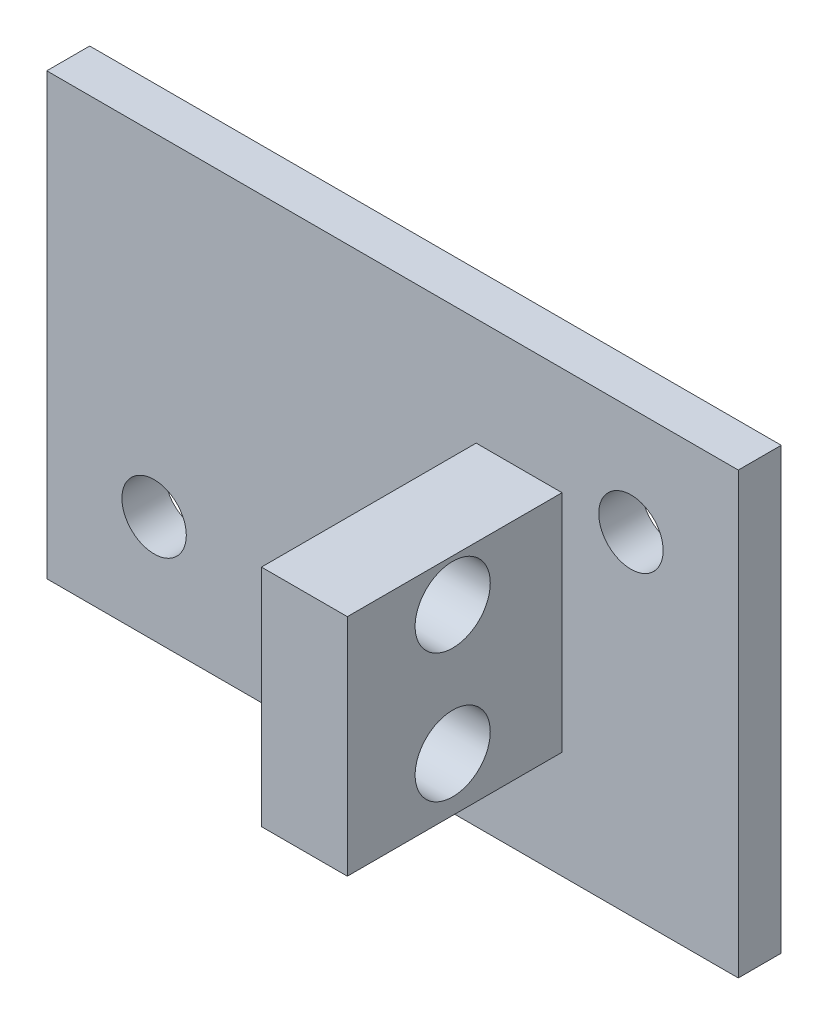
ISO-10303-21;
HEADER;
FILE_DESCRIPTION(('STEP AP214'),'2;1');
FILE_NAME('part.step','',(''),(''),'','','');
FILE_SCHEMA(('AUTOMOTIVE_DESIGN { 1 0 10303 214 1 1 1 1 }'));
ENDSEC;
DATA;
#1=APPLICATION_CONTEXT('core data for automotive mechanical design processes');
#2=APPLICATION_PROTOCOL_DEFINITION('international standard','automotive_design',2000,#1);
#3=PRODUCT_CONTEXT('',#1,'mechanical');
#4=PRODUCT('Part','Part','',(#3));
#5=PRODUCT_RELATED_PRODUCT_CATEGORY('part','',(#4));
#6=PRODUCT_DEFINITION_FORMATION('','',#4);
#7=PRODUCT_DEFINITION_CONTEXT('part definition',#1,'design');
#8=PRODUCT_DEFINITION('design','',#6,#7);
#9=PRODUCT_DEFINITION_SHAPE('','',#8);
#10=(LENGTH_UNIT() NAMED_UNIT(*) SI_UNIT(.MILLI.,.METRE.));
#11=(NAMED_UNIT(*) PLANE_ANGLE_UNIT() SI_UNIT($,.RADIAN.));
#12=(NAMED_UNIT(*) SI_UNIT($,.STERADIAN.) SOLID_ANGLE_UNIT());
#13=UNCERTAINTY_MEASURE_WITH_UNIT(LENGTH_MEASURE(1.E-05),#10,'distance_accuracy_value','');
#14=(GEOMETRIC_REPRESENTATION_CONTEXT(3) GLOBAL_UNCERTAINTY_ASSIGNED_CONTEXT((#13)) GLOBAL_UNIT_ASSIGNED_CONTEXT((#10,
#11,#12)) REPRESENTATION_CONTEXT('',''));
#15=CARTESIAN_POINT('',(0.,0.,0.));
#16=DIRECTION('',(0.,0.,1.));
#17=DIRECTION('',(1.,0.,0.));
#18=AXIS2_PLACEMENT_3D('',#15,#16,#17);
#19=CARTESIAN_POINT('',(0.,0.,2.));
#20=DIRECTION('',(0.,0.,1.));
#21=DIRECTION('',(1.,0.,0.));
#22=AXIS2_PLACEMENT_3D('',#19,#20,#21);
#23=PLANE('',#22);
#24=CARTESIAN_POINT('',(27.21,15.49,2.));
#25=DIRECTION('',(0.,0.,1.));
#26=DIRECTION('',(1.,0.,0.));
#27=AXIS2_PLACEMENT_3D('',#24,#25,#26);
#28=CIRCLE('',#27,1.5);
#29=CARTESIAN_POINT('',(28.71,15.49,2.));
#30=VERTEX_POINT('',#29);
#31=EDGE_CURVE('E143',#30,#30,#28,.T.);
#32=ORIENTED_EDGE('',*,*,#31,.F.);
#33=EDGE_LOOP('',(#32));
#34=FACE_BOUND('',#33,.T.);
#35=CARTESIAN_POINT('',(5.,5.,2.));
#36=DIRECTION('',(0.,0.,1.));
#37=DIRECTION('',(1.,0.,0.));
#38=AXIS2_PLACEMENT_3D('',#35,#36,#37);
#39=CIRCLE('',#38,1.5);
#40=CARTESIAN_POINT('',(6.5,5.,2.));
#41=VERTEX_POINT('',#40);
#42=EDGE_CURVE('E146',#41,#41,#39,.T.);
#43=ORIENTED_EDGE('',*,*,#42,.F.);
#44=EDGE_LOOP('',(#43));
#45=FACE_BOUND('',#44,.T.);
#46=DIRECTION('',(1.,0.,0.));
#47=VECTOR('',#46,1.);
#48=CARTESIAN_POINT('',(0.,0.,2.));
#49=LINE('',#48,#47);
#50=CARTESIAN_POINT('',(0.,0.,2.));
#51=VERTEX_POINT('',#50);
#52=CARTESIAN_POINT('',(32.21,0.,2.));
#53=VERTEX_POINT('',#52);
#54=EDGE_CURVE('E150',#51,#53,#49,.T.);
#55=ORIENTED_EDGE('',*,*,#54,.T.);
#56=DIRECTION('',(0.,1.,0.));
#57=VECTOR('',#56,1.);
#58=CARTESIAN_POINT('',(32.21,0.,2.));
#59=LINE('',#58,#57);
#60=CARTESIAN_POINT('',(32.21,20.49,2.));
#61=VERTEX_POINT('',#60);
#62=EDGE_CURVE('E87',#53,#61,#59,.T.);
#63=ORIENTED_EDGE('',*,*,#62,.T.);
#64=DIRECTION('',(1.,0.,0.));
#65=VECTOR('',#64,1.);
#66=CARTESIAN_POINT('',(0.,20.49,2.));
#67=LINE('',#66,#65);
#68=CARTESIAN_POINT('',(0.,20.49,2.));
#69=VERTEX_POINT('',#68);
#70=EDGE_CURVE('E153',#69,#61,#67,.T.);
#71=ORIENTED_EDGE('',*,*,#70,.F.);
#72=DIRECTION('',(0.,1.,0.));
#73=VECTOR('',#72,1.);
#74=CARTESIAN_POINT('',(0.,0.,2.));
#75=LINE('',#74,#73);
#76=EDGE_CURVE('E156',#51,#69,#75,.T.);
#77=ORIENTED_EDGE('',*,*,#76,.F.);
#78=EDGE_LOOP('',(#55,#63,#71,#77));
#79=FACE_BOUND('',#78,.T.);
#80=DIRECTION('',(-1.,0.,0.));
#81=VECTOR('',#80,1.);
#82=CARTESIAN_POINT('',(24.,15.4711517191873,2.));
#83=LINE('',#82,#81);
#84=CARTESIAN_POINT('',(24.,15.4711517191873,2.));
#85=VERTEX_POINT('',#84);
#86=CARTESIAN_POINT('',(20.,15.4711517191873,2.));
#87=VERTEX_POINT('',#86);
#88=EDGE_CURVE('E178',#85,#87,#83,.T.);
#89=ORIENTED_EDGE('',*,*,#88,.F.);
#90=DIRECTION('',(0.,1.,0.));
#91=VECTOR('',#90,1.);
#92=CARTESIAN_POINT('',(24.,15.4711517191873,2.));
#93=LINE('',#92,#91);
#94=CARTESIAN_POINT('',(24.,5.,2.));
#95=VERTEX_POINT('',#94);
#96=EDGE_CURVE('E133',#95,#85,#93,.T.);
#97=ORIENTED_EDGE('',*,*,#96,.F.);
#98=DIRECTION('',(1.,0.,0.));
#99=VECTOR('',#98,1.);
#100=CARTESIAN_POINT('',(24.,5.,2.));
#101=LINE('',#100,#99);
#102=CARTESIAN_POINT('',(20.,5.,2.));
#103=VERTEX_POINT('',#102);
#104=EDGE_CURVE('E129',#103,#95,#101,.T.);
#105=ORIENTED_EDGE('',*,*,#104,.F.);
#106=DIRECTION('',(0.,-1.,0.));
#107=VECTOR('',#106,1.);
#108=CARTESIAN_POINT('',(20.,15.4711517191873,2.));
#109=LINE('',#108,#107);
#110=EDGE_CURVE('E192',#87,#103,#109,.T.);
#111=ORIENTED_EDGE('',*,*,#110,.F.);
#112=EDGE_LOOP('',(#89,#97,#105,#111));
#113=FACE_BOUND('',#112,.T.);
#114=ADVANCED_FACE('F35',(#34,#45,#79,#113),#23,.T.);
#115=CARTESIAN_POINT('',(0.,0.,2.));
#116=DIRECTION('',(0.,1.,0.));
#117=DIRECTION('',(0.,0.,1.));
#118=AXIS2_PLACEMENT_3D('',#115,#116,#117);
#119=PLANE('',#118);
#120=DIRECTION('',(1.,0.,0.));
#121=VECTOR('',#120,1.);
#122=CARTESIAN_POINT('',(0.,0.,0.));
#123=LINE('',#122,#121);
#124=CARTESIAN_POINT('',(0.,0.,0.));
#125=VERTEX_POINT('',#124);
#126=CARTESIAN_POINT('',(32.21,0.,0.));
#127=VERTEX_POINT('',#126);
#128=EDGE_CURVE('E160',#125,#127,#123,.T.);
#129=ORIENTED_EDGE('',*,*,#128,.T.);
#130=DIRECTION('',(0.,0.,-1.));
#131=VECTOR('',#130,1.);
#132=CARTESIAN_POINT('',(32.21,0.,2.));
#133=LINE('',#132,#131);
#134=EDGE_CURVE('E11',#53,#127,#133,.T.);
#135=ORIENTED_EDGE('',*,*,#134,.F.);
#136=ORIENTED_EDGE('',*,*,#54,.F.);
#137=DIRECTION('',(0.,0.,-1.));
#138=VECTOR('',#137,1.);
#139=CARTESIAN_POINT('',(0.,0.,2.));
#140=LINE('',#139,#138);
#141=EDGE_CURVE('E61',#51,#125,#140,.T.);
#142=ORIENTED_EDGE('',*,*,#141,.T.);
#143=EDGE_LOOP('',(#129,#135,#136,#142));
#144=FACE_BOUND('',#143,.T.);
#145=ADVANCED_FACE('F212',(#144),#119,.F.);
#146=CARTESIAN_POINT('',(32.21,0.,2.));
#147=DIRECTION('',(-1.,0.,0.));
#148=DIRECTION('',(0.,0.,1.));
#149=AXIS2_PLACEMENT_3D('',#146,#147,#148);
#150=PLANE('',#149);
#151=DIRECTION('',(0.,1.,0.));
#152=VECTOR('',#151,1.);
#153=CARTESIAN_POINT('',(32.21,0.,0.));
#154=LINE('',#153,#152);
#155=CARTESIAN_POINT('',(32.21,20.49,0.));
#156=VERTEX_POINT('',#155);
#157=EDGE_CURVE('E162',#127,#156,#154,.T.);
#158=ORIENTED_EDGE('',*,*,#157,.T.);
#159=DIRECTION('',(0.,0.,-1.));
#160=VECTOR('',#159,1.);
#161=CARTESIAN_POINT('',(32.21,20.49,2.));
#162=LINE('',#161,#160);
#163=EDGE_CURVE('E44',#61,#156,#162,.T.);
#164=ORIENTED_EDGE('',*,*,#163,.F.);
#165=ORIENTED_EDGE('',*,*,#62,.F.);
#166=ORIENTED_EDGE('',*,*,#134,.T.);
#167=EDGE_LOOP('',(#158,#164,#165,#166));
#168=FACE_BOUND('',#167,.T.);
#169=ADVANCED_FACE('F218',(#168),#150,.F.);
#170=CARTESIAN_POINT('',(0.,20.49,2.));
#171=DIRECTION('',(0.,1.,0.));
#172=DIRECTION('',(0.,0.,1.));
#173=AXIS2_PLACEMENT_3D('',#170,#171,#172);
#174=PLANE('',#173);
#175=DIRECTION('',(1.,0.,0.));
#176=VECTOR('',#175,1.);
#177=CARTESIAN_POINT('',(0.,20.49,0.));
#178=LINE('',#177,#176);
#179=CARTESIAN_POINT('',(0.,20.49,0.));
#180=VERTEX_POINT('',#179);
#181=EDGE_CURVE('E165',#180,#156,#178,.T.);
#182=ORIENTED_EDGE('',*,*,#181,.F.);
#183=DIRECTION('',(0.,0.,-1.));
#184=VECTOR('',#183,1.);
#185=CARTESIAN_POINT('',(0.,20.49,2.));
#186=LINE('',#185,#184);
#187=EDGE_CURVE('E171',#69,#180,#186,.T.);
#188=ORIENTED_EDGE('',*,*,#187,.F.);
#189=ORIENTED_EDGE('',*,*,#70,.T.);
#190=ORIENTED_EDGE('',*,*,#163,.T.);
#191=EDGE_LOOP('',(#182,#188,#189,#190));
#192=FACE_BOUND('',#191,.T.);
#193=ADVANCED_FACE('F232',(#192),#174,.T.);
#194=CARTESIAN_POINT('',(5.,5.,2.));
#195=DIRECTION('',(0.,0.,-1.));
#196=DIRECTION('',(-1.,0.,0.));
#197=AXIS2_PLACEMENT_3D('',#194,#195,#196);
#198=CYLINDRICAL_SURFACE('',#197,1.5);
#199=ORIENTED_EDGE('',*,*,#42,.T.);
#200=EDGE_LOOP('',(#199));
#201=FACE_BOUND('',#200,.T.);
#202=CARTESIAN_POINT('',(5.,5.,0.));
#203=DIRECTION('',(0.,0.,1.));
#204=DIRECTION('',(1.,0.,0.));
#205=AXIS2_PLACEMENT_3D('',#202,#203,#204);
#206=CIRCLE('',#205,1.5);
#207=CARTESIAN_POINT('',(6.5,5.,0.));
#208=VERTEX_POINT('',#207);
#209=EDGE_CURVE('E138',#208,#208,#206,.T.);
#210=ORIENTED_EDGE('',*,*,#209,.F.);
#211=EDGE_LOOP('',(#210));
#212=FACE_BOUND('',#211,.T.);
#213=ADVANCED_FACE('F235',(#201,#212),#198,.F.);
#214=CARTESIAN_POINT('',(27.21,15.49,2.));
#215=DIRECTION('',(0.,0.,-1.));
#216=DIRECTION('',(-1.,0.,0.));
#217=AXIS2_PLACEMENT_3D('',#214,#215,#216);
#218=CYLINDRICAL_SURFACE('',#217,1.5);
#219=ORIENTED_EDGE('',*,*,#31,.T.);
#220=EDGE_LOOP('',(#219));
#221=FACE_BOUND('',#220,.T.);
#222=CARTESIAN_POINT('',(27.21,15.49,0.));
#223=DIRECTION('',(0.,0.,1.));
#224=DIRECTION('',(1.,0.,0.));
#225=AXIS2_PLACEMENT_3D('',#222,#223,#224);
#226=CIRCLE('',#225,1.5);
#227=CARTESIAN_POINT('',(28.71,15.49,0.));
#228=VERTEX_POINT('',#227);
#229=EDGE_CURVE('E135',#228,#228,#226,.T.);
#230=ORIENTED_EDGE('',*,*,#229,.F.);
#231=EDGE_LOOP('',(#230));
#232=FACE_BOUND('',#231,.T.);
#233=ADVANCED_FACE('F37',(#221,#232),#218,.F.);
#234=CARTESIAN_POINT('',(0.,0.,2.));
#235=DIRECTION('',(-1.,0.,0.));
#236=DIRECTION('',(0.,0.,1.));
#237=AXIS2_PLACEMENT_3D('',#234,#235,#236);
#238=PLANE('',#237);
#239=DIRECTION('',(0.,1.,0.));
#240=VECTOR('',#239,1.);
#241=CARTESIAN_POINT('',(0.,0.,0.));
#242=LINE('',#241,#240);
#243=EDGE_CURVE('E147',#125,#180,#242,.T.);
#244=ORIENTED_EDGE('',*,*,#243,.F.);
#245=ORIENTED_EDGE('',*,*,#141,.F.);
#246=ORIENTED_EDGE('',*,*,#76,.T.);
#247=ORIENTED_EDGE('',*,*,#187,.T.);
#248=EDGE_LOOP('',(#244,#245,#246,#247));
#249=FACE_BOUND('',#248,.T.);
#250=ADVANCED_FACE('F228',(#249),#238,.T.);
#251=CARTESIAN_POINT('',(0.,0.,0.));
#252=DIRECTION('',(0.,0.,1.));
#253=DIRECTION('',(1.,0.,0.));
#254=AXIS2_PLACEMENT_3D('',#251,#252,#253);
#255=PLANE('',#254);
#256=ORIENTED_EDGE('',*,*,#229,.T.);
#257=EDGE_LOOP('',(#256));
#258=FACE_BOUND('',#257,.T.);
#259=ORIENTED_EDGE('',*,*,#209,.T.);
#260=EDGE_LOOP('',(#259));
#261=FACE_BOUND('',#260,.T.);
#262=ORIENTED_EDGE('',*,*,#128,.F.);
#263=ORIENTED_EDGE('',*,*,#243,.T.);
#264=ORIENTED_EDGE('',*,*,#181,.T.);
#265=ORIENTED_EDGE('',*,*,#157,.F.);
#266=EDGE_LOOP('',(#262,#263,#264,#265));
#267=FACE_BOUND('',#266,.T.);
#268=ADVANCED_FACE('F225',(#258,#261,#267),#255,.F.);
#269=CARTESIAN_POINT('',(24.,15.4711517191873,12.));
#270=DIRECTION('',(-1.,0.,0.));
#271=DIRECTION('',(0.,0.,1.));
#272=AXIS2_PLACEMENT_3D('',#269,#270,#271);
#273=PLANE('',#272);
#274=CARTESIAN_POINT('',(24.,7.5,7.0924867986547));
#275=DIRECTION('',(1.,0.,0.));
#276=DIRECTION('',(0.,0.,-1.));
#277=AXIS2_PLACEMENT_3D('',#274,#275,#276);
#278=CIRCLE('',#277,1.75);
#279=CARTESIAN_POINT('',(24.,7.5,5.3424867986547));
#280=VERTEX_POINT('',#279);
#281=EDGE_CURVE('E185',#280,#280,#278,.T.);
#282=ORIENTED_EDGE('',*,*,#281,.F.);
#283=EDGE_LOOP('',(#282));
#284=FACE_BOUND('',#283,.T.);
#285=CARTESIAN_POINT('',(24.,13.5,7.0924867986547));
#286=DIRECTION('',(1.,0.,0.));
#287=DIRECTION('',(0.,0.,-1.));
#288=AXIS2_PLACEMENT_3D('',#285,#286,#287);
#289=CIRCLE('',#288,1.75);
#290=CARTESIAN_POINT('',(24.,13.5,5.3424867986547));
#291=VERTEX_POINT('',#290);
#292=EDGE_CURVE('E175',#291,#291,#289,.T.);
#293=ORIENTED_EDGE('',*,*,#292,.F.);
#294=EDGE_LOOP('',(#293));
#295=FACE_BOUND('',#294,.T.);
#296=ORIENTED_EDGE('',*,*,#96,.T.);
#297=DIRECTION('',(0.,0.,-1.));
#298=VECTOR('',#297,1.);
#299=CARTESIAN_POINT('',(24.,15.4711517191873,12.));
#300=LINE('',#299,#298);
#301=CARTESIAN_POINT('',(24.,15.4711517191873,12.));
#302=VERTEX_POINT('',#301);
#303=EDGE_CURVE('E114',#302,#85,#300,.T.);
#304=ORIENTED_EDGE('',*,*,#303,.F.);
#305=DIRECTION('',(0.,1.,0.));
#306=VECTOR('',#305,1.);
#307=CARTESIAN_POINT('',(24.,15.4711517191873,12.));
#308=LINE('',#307,#306);
#309=CARTESIAN_POINT('',(24.,5.,12.));
#310=VERTEX_POINT('',#309);
#311=EDGE_CURVE('E121',#310,#302,#308,.T.);
#312=ORIENTED_EDGE('',*,*,#311,.F.);
#313=DIRECTION('',(0.,0.,-1.));
#314=VECTOR('',#313,1.);
#315=CARTESIAN_POINT('',(24.,5.,12.));
#316=LINE('',#315,#314);
#317=EDGE_CURVE('E189',#310,#95,#316,.T.);
#318=ORIENTED_EDGE('',*,*,#317,.T.);
#319=EDGE_LOOP('',(#296,#304,#312,#318));
#320=FACE_BOUND('',#319,.T.);
#321=ADVANCED_FACE('F131',(#284,#295,#320),#273,.F.);
#322=CARTESIAN_POINT('',(24.,15.4711517191873,12.));
#323=DIRECTION('',(0.,-1.,0.));
#324=DIRECTION('',(1.,0.,0.));
#325=AXIS2_PLACEMENT_3D('',#322,#323,#324);
#326=PLANE('',#325);
#327=ORIENTED_EDGE('',*,*,#88,.T.);
#328=DIRECTION('',(0.,0.,-1.));
#329=VECTOR('',#328,1.);
#330=CARTESIAN_POINT('',(20.,15.4711517191873,12.));
#331=LINE('',#330,#329);
#332=CARTESIAN_POINT('',(20.,15.4711517191873,12.));
#333=VERTEX_POINT('',#332);
#334=EDGE_CURVE('E117',#333,#87,#331,.T.);
#335=ORIENTED_EDGE('',*,*,#334,.F.);
#336=DIRECTION('',(-1.,0.,0.));
#337=VECTOR('',#336,1.);
#338=CARTESIAN_POINT('',(24.,15.4711517191873,12.));
#339=LINE('',#338,#337);
#340=EDGE_CURVE('E110',#302,#333,#339,.T.);
#341=ORIENTED_EDGE('',*,*,#340,.F.);
#342=ORIENTED_EDGE('',*,*,#303,.T.);
#343=EDGE_LOOP('',(#327,#335,#341,#342));
#344=FACE_BOUND('',#343,.T.);
#345=ADVANCED_FACE('F112',(#344),#326,.F.);
#346=CARTESIAN_POINT('',(20.,15.4711517191873,12.));
#347=DIRECTION('',(1.,0.,0.));
#348=DIRECTION('',(0.,0.,-1.));
#349=AXIS2_PLACEMENT_3D('',#346,#347,#348);
#350=PLANE('',#349);
#351=CARTESIAN_POINT('',(20.,7.5,7.0924867986547));
#352=DIRECTION('',(1.,0.,0.));
#353=DIRECTION('',(0.,0.,-1.));
#354=AXIS2_PLACEMENT_3D('',#351,#352,#353);
#355=CIRCLE('',#354,1.75);
#356=CARTESIAN_POINT('',(20.,7.5,5.3424867986547));
#357=VERTEX_POINT('',#356);
#358=EDGE_CURVE('E39',#357,#357,#355,.T.);
#359=ORIENTED_EDGE('',*,*,#358,.T.);
#360=EDGE_LOOP('',(#359));
#361=FACE_BOUND('',#360,.T.);
#362=CARTESIAN_POINT('',(20.,13.5,7.0924867986547));
#363=DIRECTION('',(1.,0.,0.));
#364=DIRECTION('',(0.,0.,-1.));
#365=AXIS2_PLACEMENT_3D('',#362,#363,#364);
#366=CIRCLE('',#365,1.75);
#367=CARTESIAN_POINT('',(20.,13.5,5.3424867986547));
#368=VERTEX_POINT('',#367);
#369=EDGE_CURVE('E173',#368,#368,#366,.T.);
#370=ORIENTED_EDGE('',*,*,#369,.T.);
#371=EDGE_LOOP('',(#370));
#372=FACE_BOUND('',#371,.T.);
#373=ORIENTED_EDGE('',*,*,#110,.T.);
#374=DIRECTION('',(0.,0.,-1.));
#375=VECTOR('',#374,1.);
#376=CARTESIAN_POINT('',(20.,5.,12.));
#377=LINE('',#376,#375);
#378=CARTESIAN_POINT('',(20.,5.,12.));
#379=VERTEX_POINT('',#378);
#380=EDGE_CURVE('E52',#379,#103,#377,.T.);
#381=ORIENTED_EDGE('',*,*,#380,.F.);
#382=DIRECTION('',(0.,-1.,0.));
#383=VECTOR('',#382,1.);
#384=CARTESIAN_POINT('',(20.,15.4711517191873,12.));
#385=LINE('',#384,#383);
#386=EDGE_CURVE('E120',#333,#379,#385,.T.);
#387=ORIENTED_EDGE('',*,*,#386,.F.);
#388=ORIENTED_EDGE('',*,*,#334,.T.);
#389=EDGE_LOOP('',(#373,#381,#387,#388));
#390=FACE_BOUND('',#389,.T.);
#391=ADVANCED_FACE('F199',(#361,#372,#390),#350,.F.);
#392=CARTESIAN_POINT('',(24.,5.,12.));
#393=DIRECTION('',(0.,1.,0.));
#394=DIRECTION('',(-1.,0.,0.));
#395=AXIS2_PLACEMENT_3D('',#392,#393,#394);
#396=PLANE('',#395);
#397=ORIENTED_EDGE('',*,*,#104,.T.);
#398=ORIENTED_EDGE('',*,*,#317,.F.);
#399=DIRECTION('',(1.,0.,0.));
#400=VECTOR('',#399,1.);
#401=CARTESIAN_POINT('',(24.,5.,12.));
#402=LINE('',#401,#400);
#403=EDGE_CURVE('E125',#379,#310,#402,.T.);
#404=ORIENTED_EDGE('',*,*,#403,.F.);
#405=ORIENTED_EDGE('',*,*,#380,.T.);
#406=EDGE_LOOP('',(#397,#398,#404,#405));
#407=FACE_BOUND('',#406,.T.);
#408=ADVANCED_FACE('F200',(#407),#396,.F.);
#409=CARTESIAN_POINT('',(0.,0.,12.));
#410=DIRECTION('',(0.,0.,-1.));
#411=DIRECTION('',(-1.,0.,0.));
#412=AXIS2_PLACEMENT_3D('',#409,#410,#411);
#413=PLANE('',#412);
#414=ORIENTED_EDGE('',*,*,#311,.T.);
#415=ORIENTED_EDGE('',*,*,#340,.T.);
#416=ORIENTED_EDGE('',*,*,#386,.T.);
#417=ORIENTED_EDGE('',*,*,#403,.T.);
#418=EDGE_LOOP('',(#414,#415,#416,#417));
#419=FACE_BOUND('',#418,.T.);
#420=ADVANCED_FACE('F124',(#419),#413,.F.);
#421=CARTESIAN_POINT('',(14.,13.5,7.0924867986547));
#422=DIRECTION('',(1.,0.,0.));
#423=DIRECTION('',(0.,0.,-1.));
#424=AXIS2_PLACEMENT_3D('',#421,#422,#423);
#425=CYLINDRICAL_SURFACE('',#424,1.75);
#426=ORIENTED_EDGE('',*,*,#292,.T.);
#427=EDGE_LOOP('',(#426));
#428=FACE_BOUND('',#427,.T.);
#429=ORIENTED_EDGE('',*,*,#369,.F.);
#430=EDGE_LOOP('',(#429));
#431=FACE_BOUND('',#430,.T.);
#432=ADVANCED_FACE('F207',(#428,#431),#425,.F.);
#433=CARTESIAN_POINT('',(14.,7.5,7.0924867986547));
#434=DIRECTION('',(1.,0.,0.));
#435=DIRECTION('',(0.,0.,-1.));
#436=AXIS2_PLACEMENT_3D('',#433,#434,#435);
#437=CYLINDRICAL_SURFACE('',#436,1.75);
#438=ORIENTED_EDGE('',*,*,#281,.T.);
#439=EDGE_LOOP('',(#438));
#440=FACE_BOUND('',#439,.T.);
#441=ORIENTED_EDGE('',*,*,#358,.F.);
#442=EDGE_LOOP('',(#441));
#443=FACE_BOUND('',#442,.T.);
#444=ADVANCED_FACE('F292',(#440,#443),#437,.F.);
#445=CLOSED_SHELL('',(#114,#145,#169,#193,#213,#233,#250,#268,#321,#345,#391,#408,#420,#432,#444));
#446=MANIFOLD_SOLID_BREP('B2',#445);
#447=ADVANCED_BREP_SHAPE_REPRESENTATION('',(#18,#446),#14);
#448=SHAPE_DEFINITION_REPRESENTATION(#9,#447);
ENDSEC;
END-ISO-10303-21;
